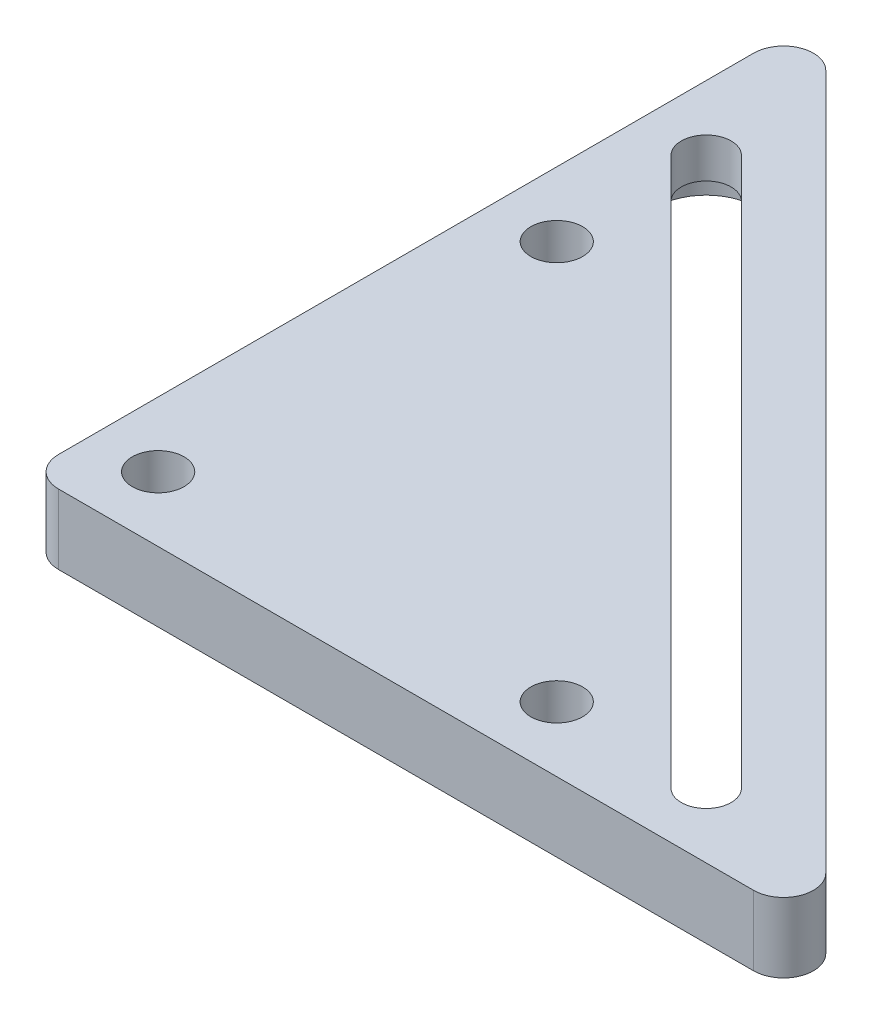
ISO-10303-21;
HEADER;
FILE_DESCRIPTION(('STEP AP214'),'2;1');
FILE_NAME('part.step','',(''),(''),'','','');
FILE_SCHEMA(('AUTOMOTIVE_DESIGN { 1 0 10303 214 1 1 1 1 }'));
ENDSEC;
DATA;
#1=APPLICATION_CONTEXT('core data for automotive mechanical design processes');
#2=APPLICATION_PROTOCOL_DEFINITION('international standard','automotive_design',2000,#1);
#3=PRODUCT_CONTEXT('',#1,'mechanical');
#4=PRODUCT('Part','Part','',(#3));
#5=PRODUCT_RELATED_PRODUCT_CATEGORY('part','',(#4));
#6=PRODUCT_DEFINITION_FORMATION('','',#4);
#7=PRODUCT_DEFINITION_CONTEXT('part definition',#1,'design');
#8=PRODUCT_DEFINITION('design','',#6,#7);
#9=PRODUCT_DEFINITION_SHAPE('','',#8);
#10=(LENGTH_UNIT() NAMED_UNIT(*) SI_UNIT(.MILLI.,.METRE.));
#11=(NAMED_UNIT(*) PLANE_ANGLE_UNIT() SI_UNIT($,.RADIAN.));
#12=(NAMED_UNIT(*) SI_UNIT($,.STERADIAN.) SOLID_ANGLE_UNIT());
#13=UNCERTAINTY_MEASURE_WITH_UNIT(LENGTH_MEASURE(1.E-05),#10,'distance_accuracy_value','');
#14=(GEOMETRIC_REPRESENTATION_CONTEXT(3) GLOBAL_UNCERTAINTY_ASSIGNED_CONTEXT((#13)) GLOBAL_UNIT_ASSIGNED_CONTEXT((#10,
#11,#12)) REPRESENTATION_CONTEXT('',''));
#15=CARTESIAN_POINT('',(0.,0.,0.));
#16=DIRECTION('',(0.,0.,1.));
#17=DIRECTION('',(1.,0.,0.));
#18=AXIS2_PLACEMENT_3D('',#15,#16,#17);
#19=CARTESIAN_POINT('',(6.5,0.,-6.5));
#20=DIRECTION('',(0.,1.,0.));
#21=DIRECTION('',(0.,0.,1.));
#22=AXIS2_PLACEMENT_3D('',#19,#20,#21);
#23=CYLINDRICAL_SURFACE('',#22,2.6);
#24=CARTESIAN_POINT('',(6.5,0.,-6.5));
#25=DIRECTION('',(0.,1.,0.));
#26=DIRECTION('',(0.,0.,1.));
#27=AXIS2_PLACEMENT_3D('',#24,#25,#26);
#28=CIRCLE('',#27,2.6);
#29=CARTESIAN_POINT('',(6.5,0.,-3.9));
#30=VERTEX_POINT('',#29);
#31=EDGE_CURVE('E291',#30,#30,#28,.T.);
#32=ORIENTED_EDGE('',*,*,#31,.F.);
#33=EDGE_LOOP('',(#32));
#34=FACE_BOUND('',#33,.T.);
#35=CARTESIAN_POINT('',(6.5,7.,-6.5));
#36=DIRECTION('',(0.,1.,0.));
#37=DIRECTION('',(0.,0.,1.));
#38=AXIS2_PLACEMENT_3D('',#35,#36,#37);
#39=CIRCLE('',#38,2.6);
#40=CARTESIAN_POINT('',(6.5,7.,-3.9));
#41=VERTEX_POINT('',#40);
#42=EDGE_CURVE('E240',#41,#41,#39,.F.);
#43=ORIENTED_EDGE('',*,*,#42,.F.);
#44=EDGE_LOOP('',(#43));
#45=FACE_BOUND('',#44,.T.);
#46=ADVANCED_FACE('F64',(#34,#45),#23,.F.);
#47=CARTESIAN_POINT('',(46.5,0.,-6.5));
#48=DIRECTION('',(0.,1.,0.));
#49=DIRECTION('',(0.,0.,1.));
#50=AXIS2_PLACEMENT_3D('',#47,#48,#49);
#51=CYLINDRICAL_SURFACE('',#50,2.6);
#52=CARTESIAN_POINT('',(46.5,0.,-6.5));
#53=DIRECTION('',(0.,1.,0.));
#54=DIRECTION('',(0.,0.,1.));
#55=AXIS2_PLACEMENT_3D('',#52,#53,#54);
#56=CIRCLE('',#55,2.6);
#57=CARTESIAN_POINT('',(46.5,0.,-3.9));
#58=VERTEX_POINT('',#57);
#59=EDGE_CURVE('E279',#58,#58,#56,.T.);
#60=ORIENTED_EDGE('',*,*,#59,.F.);
#61=EDGE_LOOP('',(#60));
#62=FACE_BOUND('',#61,.T.);
#63=CARTESIAN_POINT('',(46.5,7.,-6.5));
#64=DIRECTION('',(0.,1.,0.));
#65=DIRECTION('',(0.,0.,1.));
#66=AXIS2_PLACEMENT_3D('',#63,#64,#65);
#67=CIRCLE('',#66,2.6);
#68=CARTESIAN_POINT('',(46.5,7.,-3.9));
#69=VERTEX_POINT('',#68);
#70=EDGE_CURVE('E236',#69,#69,#67,.F.);
#71=ORIENTED_EDGE('',*,*,#70,.F.);
#72=EDGE_LOOP('',(#71));
#73=FACE_BOUND('',#72,.T.);
#74=ADVANCED_FACE('F372',(#62,#73),#51,.F.);
#75=CARTESIAN_POINT('',(3.,10.,-3.));
#76=DIRECTION('',(0.,1.,0.));
#77=DIRECTION('',(0.,0.,1.));
#78=AXIS2_PLACEMENT_3D('',#75,#76,#77);
#79=CYLINDRICAL_SURFACE('',#78,3.);
#80=DIRECTION('',(0.,1.,0.));
#81=VECTOR('',#80,1.);
#82=CARTESIAN_POINT('',(3.,10.,0.));
#83=LINE('',#82,#81);
#84=CARTESIAN_POINT('',(3.,7.,0.));
#85=VERTEX_POINT('',#84);
#86=CARTESIAN_POINT('',(3.,0.,0.));
#87=VERTEX_POINT('',#86);
#88=EDGE_CURVE('E331',#85,#87,#83,.F.);
#89=ORIENTED_EDGE('',*,*,#88,.F.);
#90=CARTESIAN_POINT('',(3.,7.,-3.));
#91=DIRECTION('',(0.,1.,0.));
#92=DIRECTION('',(0.,0.,1.));
#93=AXIS2_PLACEMENT_3D('',#90,#91,#92);
#94=CIRCLE('',#93,3.);
#95=CARTESIAN_POINT('',(0.,7.,-3.));
#96=VERTEX_POINT('',#95);
#97=EDGE_CURVE('E222',#85,#96,#94,.F.);
#98=ORIENTED_EDGE('',*,*,#97,.T.);
#99=DIRECTION('',(0.,1.,0.));
#100=VECTOR('',#99,1.);
#101=CARTESIAN_POINT('',(0.,10.,-3.));
#102=LINE('',#101,#100);
#103=CARTESIAN_POINT('',(0.,0.,-3.));
#104=VERTEX_POINT('',#103);
#105=EDGE_CURVE('E327',#104,#96,#102,.T.);
#106=ORIENTED_EDGE('',*,*,#105,.F.);
#107=CARTESIAN_POINT('',(3.,0.,-3.));
#108=DIRECTION('',(0.,1.,0.));
#109=DIRECTION('',(0.,0.,1.));
#110=AXIS2_PLACEMENT_3D('',#107,#108,#109);
#111=CIRCLE('',#110,3.);
#112=EDGE_CURVE('E73',#87,#104,#111,.F.);
#113=ORIENTED_EDGE('',*,*,#112,.F.);
#114=EDGE_LOOP('',(#89,#98,#106,#113));
#115=FACE_BOUND('',#114,.T.);
#116=ADVANCED_FACE('F66',(#115),#79,.T.);
#117=CARTESIAN_POINT('',(3.,10.,-72.7573593128807));
#118=DIRECTION('',(0.,1.,0.));
#119=DIRECTION('',(0.,0.,1.));
#120=AXIS2_PLACEMENT_3D('',#117,#118,#119);
#121=CYLINDRICAL_SURFACE('',#120,3.);
#122=DIRECTION('',(0.,1.,0.));
#123=VECTOR('',#122,1.);
#124=CARTESIAN_POINT('',(0.,10.,-72.7573593128807));
#125=LINE('',#124,#123);
#126=CARTESIAN_POINT('',(0.,7.,-72.7573593128807));
#127=VERTEX_POINT('',#126);
#128=CARTESIAN_POINT('',(0.,0.,-72.7573593128807));
#129=VERTEX_POINT('',#128);
#130=EDGE_CURVE('E321',#127,#129,#125,.F.);
#131=ORIENTED_EDGE('',*,*,#130,.F.);
#132=CARTESIAN_POINT('',(3.,7.,-72.7573593128807));
#133=DIRECTION('',(0.,1.,0.));
#134=DIRECTION('',(0.,0.,1.));
#135=AXIS2_PLACEMENT_3D('',#132,#133,#134);
#136=CIRCLE('',#135,3.);
#137=CARTESIAN_POINT('',(5.12132034355964,7.,-74.8786796564404));
#138=VERTEX_POINT('',#137);
#139=EDGE_CURVE('E213',#127,#138,#136,.F.);
#140=ORIENTED_EDGE('',*,*,#139,.T.);
#141=DIRECTION('',(0.,1.,0.));
#142=VECTOR('',#141,1.);
#143=CARTESIAN_POINT('',(5.12132034355964,10.,-74.8786796564404));
#144=LINE('',#143,#142);
#145=CARTESIAN_POINT('',(5.12132034355964,0.,-74.8786796564404));
#146=VERTEX_POINT('',#145);
#147=EDGE_CURVE('E317',#146,#138,#144,.T.);
#148=ORIENTED_EDGE('',*,*,#147,.F.);
#149=CARTESIAN_POINT('',(3.,0.,-72.7573593128807));
#150=DIRECTION('',(0.,1.,0.));
#151=DIRECTION('',(0.,0.,1.));
#152=AXIS2_PLACEMENT_3D('',#149,#150,#151);
#153=CIRCLE('',#152,3.);
#154=EDGE_CURVE('E324',#129,#146,#153,.F.);
#155=ORIENTED_EDGE('',*,*,#154,.F.);
#156=EDGE_LOOP('',(#131,#140,#148,#155));
#157=FACE_BOUND('',#156,.T.);
#158=ADVANCED_FACE('F349',(#157),#121,.T.);
#159=CARTESIAN_POINT('',(72.7573593128807,10.,-3.));
#160=DIRECTION('',(0.,1.,0.));
#161=DIRECTION('',(0.,0.,1.));
#162=AXIS2_PLACEMENT_3D('',#159,#160,#161);
#163=CYLINDRICAL_SURFACE('',#162,3.);
#164=DIRECTION('',(0.,1.,0.));
#165=VECTOR('',#164,1.);
#166=CARTESIAN_POINT('',(74.8786796564403,10.,-5.12132034355967));
#167=LINE('',#166,#165);
#168=CARTESIAN_POINT('',(74.8786796564403,7.,-5.12132034355967));
#169=VERTEX_POINT('',#168);
#170=CARTESIAN_POINT('',(74.8786796564403,0.,-5.12132034355967));
#171=VERTEX_POINT('',#170);
#172=EDGE_CURVE('E310',#169,#171,#167,.F.);
#173=ORIENTED_EDGE('',*,*,#172,.F.);
#174=CARTESIAN_POINT('',(72.7573593128807,7.,-3.));
#175=DIRECTION('',(0.,1.,0.));
#176=DIRECTION('',(0.,0.,1.));
#177=AXIS2_PLACEMENT_3D('',#174,#175,#176);
#178=CIRCLE('',#177,3.);
#179=CARTESIAN_POINT('',(72.7573593128807,7.,0.));
#180=VERTEX_POINT('',#179);
#181=EDGE_CURVE('E232',#169,#180,#178,.F.);
#182=ORIENTED_EDGE('',*,*,#181,.T.);
#183=DIRECTION('',(0.,1.,0.));
#184=VECTOR('',#183,1.);
#185=CARTESIAN_POINT('',(72.7573593128807,10.,0.));
#186=LINE('',#185,#184);
#187=CARTESIAN_POINT('',(72.7573593128807,0.,0.));
#188=VERTEX_POINT('',#187);
#189=EDGE_CURVE('E306',#188,#180,#186,.T.);
#190=ORIENTED_EDGE('',*,*,#189,.F.);
#191=CARTESIAN_POINT('',(72.7573593128807,0.,-3.));
#192=DIRECTION('',(0.,1.,0.));
#193=DIRECTION('',(0.,0.,1.));
#194=AXIS2_PLACEMENT_3D('',#191,#192,#193);
#195=CIRCLE('',#194,3.);
#196=EDGE_CURVE('E313',#171,#188,#195,.F.);
#197=ORIENTED_EDGE('',*,*,#196,.F.);
#198=EDGE_LOOP('',(#173,#182,#190,#197));
#199=FACE_BOUND('',#198,.T.);
#200=ADVANCED_FACE('F358',(#199),#163,.T.);
#201=CARTESIAN_POINT('',(0.,10.,0.));
#202=DIRECTION('',(0.,0.,-1.));
#203=DIRECTION('',(-1.,0.,0.));
#204=AXIS2_PLACEMENT_3D('',#201,#202,#203);
#205=PLANE('',#204);
#206=DIRECTION('',(1.,0.,0.));
#207=VECTOR('',#206,1.);
#208=CARTESIAN_POINT('',(0.,7.,0.));
#209=LINE('',#208,#207);
#210=EDGE_CURVE('E229',#85,#180,#209,.T.);
#211=ORIENTED_EDGE('',*,*,#210,.F.);
#212=ORIENTED_EDGE('',*,*,#88,.T.);
#213=DIRECTION('',(1.,0.,0.));
#214=VECTOR('',#213,1.);
#215=CARTESIAN_POINT('',(0.,0.,0.));
#216=LINE('',#215,#214);
#217=EDGE_CURVE('E295',#87,#188,#216,.T.);
#218=ORIENTED_EDGE('',*,*,#217,.T.);
#219=ORIENTED_EDGE('',*,*,#189,.T.);
#220=EDGE_LOOP('',(#211,#212,#218,#219));
#221=FACE_BOUND('',#220,.T.);
#222=ADVANCED_FACE('F361',(#221),#205,.F.);
#223=CARTESIAN_POINT('',(0.,10.,-80.));
#224=DIRECTION('',(-0.707106781186548,0.,0.707106781186548));
#225=DIRECTION('',(0.707106781186548,0.,0.707106781186548));
#226=AXIS2_PLACEMENT_3D('',#223,#224,#225);
#227=PLANE('',#226);
#228=DIRECTION('',(-0.707106781186548,0.,-0.707106781186548));
#229=VECTOR('',#228,1.);
#230=CARTESIAN_POINT('',(0.,7.,-80.));
#231=LINE('',#230,#229);
#232=EDGE_CURVE('E226',#169,#138,#231,.T.);
#233=ORIENTED_EDGE('',*,*,#232,.F.);
#234=ORIENTED_EDGE('',*,*,#172,.T.);
#235=DIRECTION('',(-0.707106781186548,0.,-0.707106781186548));
#236=VECTOR('',#235,1.);
#237=CARTESIAN_POINT('',(0.,0.,-80.));
#238=LINE('',#237,#236);
#239=EDGE_CURVE('E298',#171,#146,#238,.T.);
#240=ORIENTED_EDGE('',*,*,#239,.T.);
#241=ORIENTED_EDGE('',*,*,#147,.T.);
#242=EDGE_LOOP('',(#233,#234,#240,#241));
#243=FACE_BOUND('',#242,.T.);
#244=ADVANCED_FACE('F355',(#243),#227,.F.);
#245=CARTESIAN_POINT('',(0.,10.,0.));
#246=DIRECTION('',(1.,0.,0.));
#247=DIRECTION('',(0.,0.,-1.));
#248=AXIS2_PLACEMENT_3D('',#245,#246,#247);
#249=PLANE('',#248);
#250=DIRECTION('',(0.,0.,1.));
#251=VECTOR('',#250,1.);
#252=CARTESIAN_POINT('',(0.,7.,0.));
#253=LINE('',#252,#251);
#254=EDGE_CURVE('E12',#127,#96,#253,.T.);
#255=ORIENTED_EDGE('',*,*,#254,.F.);
#256=ORIENTED_EDGE('',*,*,#130,.T.);
#257=DIRECTION('',(0.,0.,1.));
#258=VECTOR('',#257,1.);
#259=CARTESIAN_POINT('',(0.,0.,0.));
#260=LINE('',#259,#258);
#261=EDGE_CURVE('E302',#129,#104,#260,.T.);
#262=ORIENTED_EDGE('',*,*,#261,.T.);
#263=ORIENTED_EDGE('',*,*,#105,.T.);
#264=EDGE_LOOP('',(#255,#256,#262,#263));
#265=FACE_BOUND('',#264,.T.);
#266=ADVANCED_FACE('F344',(#265),#249,.F.);
#267=CARTESIAN_POINT('',(0.,0.,0.));
#268=DIRECTION('',(0.,1.,0.));
#269=DIRECTION('',(0.,0.,1.));
#270=AXIS2_PLACEMENT_3D('',#267,#268,#269);
#271=PLANE('',#270);
#272=CARTESIAN_POINT('',(6.5,0.,-46.5));
#273=DIRECTION('',(0.,1.,0.));
#274=DIRECTION('',(0.,0.,1.));
#275=AXIS2_PLACEMENT_3D('',#272,#273,#274);
#276=CIRCLE('',#275,2.6);
#277=CARTESIAN_POINT('',(6.5,0.,-43.9));
#278=VERTEX_POINT('',#277);
#279=EDGE_CURVE('E205',#278,#278,#276,.T.);
#280=ORIENTED_EDGE('',*,*,#279,.T.);
#281=EDGE_LOOP('',(#280));
#282=FACE_BOUND('',#281,.T.);
#283=DIRECTION('',(0.707106781186548,0.,0.707106781186548));
#284=VECTOR('',#283,1.);
#285=CARTESIAN_POINT('',(37.5355339059327,0.,-37.5355339059327));
#286=LINE('',#285,#284);
#287=CARTESIAN_POINT('',(10.0355339059327,0.,-65.0355339059327));
#288=VERTEX_POINT('',#287);
#289=CARTESIAN_POINT('',(65.0355339059327,0.,-10.0355339059327));
#290=VERTEX_POINT('',#289);
#291=EDGE_CURVE('E244',#288,#290,#286,.T.);
#292=ORIENTED_EDGE('',*,*,#291,.F.);
#293=CARTESIAN_POINT('',(6.50000000000001,0.,-61.5));
#294=DIRECTION('',(0.,-1.,0.));
#295=DIRECTION('',(0.,0.,-1.));
#296=AXIS2_PLACEMENT_3D('',#293,#294,#295);
#297=CIRCLE('',#296,5.);
#298=CARTESIAN_POINT('',(2.96446609406727,0.,-57.9644660940673));
#299=VERTEX_POINT('',#298);
#300=EDGE_CURVE('E250',#299,#288,#297,.T.);
#301=ORIENTED_EDGE('',*,*,#300,.F.);
#302=DIRECTION('',(0.707106781186548,0.,0.707106781186548));
#303=VECTOR('',#302,1.);
#304=CARTESIAN_POINT('',(30.4644660940673,0.,-30.4644660940673));
#305=LINE('',#304,#303);
#306=CARTESIAN_POINT('',(57.9644660940673,0.,-2.96446609406726));
#307=VERTEX_POINT('',#306);
#308=EDGE_CURVE('E269',#299,#307,#305,.T.);
#309=ORIENTED_EDGE('',*,*,#308,.T.);
#310=CARTESIAN_POINT('',(61.5,0.,-6.5));
#311=DIRECTION('',(0.,-1.,0.));
#312=DIRECTION('',(0.,0.,-1.));
#313=AXIS2_PLACEMENT_3D('',#310,#311,#312);
#314=CIRCLE('',#313,5.);
#315=EDGE_CURVE('E265',#290,#307,#314,.T.);
#316=ORIENTED_EDGE('',*,*,#315,.F.);
#317=EDGE_LOOP('',(#292,#301,#309,#316));
#318=FACE_BOUND('',#317,.T.);
#319=ORIENTED_EDGE('',*,*,#59,.T.);
#320=EDGE_LOOP('',(#319));
#321=FACE_BOUND('',#320,.T.);
#322=ORIENTED_EDGE('',*,*,#31,.T.);
#323=EDGE_LOOP('',(#322));
#324=FACE_BOUND('',#323,.T.);
#325=ORIENTED_EDGE('',*,*,#217,.F.);
#326=ORIENTED_EDGE('',*,*,#112,.T.);
#327=ORIENTED_EDGE('',*,*,#261,.F.);
#328=ORIENTED_EDGE('',*,*,#154,.T.);
#329=ORIENTED_EDGE('',*,*,#239,.F.);
#330=ORIENTED_EDGE('',*,*,#196,.T.);
#331=EDGE_LOOP('',(#325,#326,#327,#328,#329,#330));
#332=FACE_BOUND('',#331,.T.);
#333=ADVANCED_FACE('F339',(#282,#318,#321,#324,#332),#271,.F.);
#334=CARTESIAN_POINT('',(6.50000000000001,3.,-61.5));
#335=DIRECTION('',(0.,-1.,0.));
#336=DIRECTION('',(0.,0.,-1.));
#337=AXIS2_PLACEMENT_3D('',#334,#335,#336);
#338=CYLINDRICAL_SURFACE('',#337,5.);
#339=ORIENTED_EDGE('',*,*,#300,.T.);
#340=DIRECTION('',(0.,-1.,0.));
#341=VECTOR('',#340,1.);
#342=CARTESIAN_POINT('',(10.0355339059327,3.,-65.0355339059327));
#343=LINE('',#342,#341);
#344=CARTESIAN_POINT('',(10.0355339059327,3.,-65.0355339059327));
#345=VERTEX_POINT('',#344);
#346=EDGE_CURVE('E275',#345,#288,#343,.T.);
#347=ORIENTED_EDGE('',*,*,#346,.F.);
#348=CARTESIAN_POINT('',(6.50000000000001,3.,-61.5));
#349=DIRECTION('',(0.,-1.,0.));
#350=DIRECTION('',(0.,0.,-1.));
#351=AXIS2_PLACEMENT_3D('',#348,#349,#350);
#352=CIRCLE('',#351,5.);
#353=CARTESIAN_POINT('',(2.96446609406727,3.,-57.9644660940673));
#354=VERTEX_POINT('',#353);
#355=EDGE_CURVE('E257',#354,#345,#352,.T.);
#356=ORIENTED_EDGE('',*,*,#355,.F.);
#357=DIRECTION('',(0.,-1.,0.));
#358=VECTOR('',#357,1.);
#359=CARTESIAN_POINT('',(2.96446609406727,3.,-57.9644660940673));
#360=LINE('',#359,#358);
#361=EDGE_CURVE('E280',#354,#299,#360,.T.);
#362=ORIENTED_EDGE('',*,*,#361,.T.);
#363=EDGE_LOOP('',(#339,#347,#356,#362));
#364=FACE_BOUND('',#363,.T.);
#365=ADVANCED_FACE('F386',(#364),#338,.F.);
#366=CARTESIAN_POINT('',(30.4644660940673,3.,-30.4644660940673));
#367=DIRECTION('',(0.707106781186547,0.,-0.707106781186547));
#368=DIRECTION('',(-0.707106781186548,0.,-0.707106781186548));
#369=AXIS2_PLACEMENT_3D('',#366,#367,#368);
#370=PLANE('',#369);
#371=ORIENTED_EDGE('',*,*,#308,.F.);
#372=ORIENTED_EDGE('',*,*,#361,.F.);
#373=DIRECTION('',(0.707106781186548,0.,0.707106781186548));
#374=VECTOR('',#373,1.);
#375=CARTESIAN_POINT('',(30.4644660940673,3.,-30.4644660940673));
#376=LINE('',#375,#374);
#377=CARTESIAN_POINT('',(57.9644660940673,3.,-2.96446609406726));
#378=VERTEX_POINT('',#377);
#379=EDGE_CURVE('E254',#354,#378,#376,.T.);
#380=ORIENTED_EDGE('',*,*,#379,.T.);
#381=DIRECTION('',(0.,-1.,0.));
#382=VECTOR('',#381,1.);
#383=CARTESIAN_POINT('',(57.9644660940673,3.,-2.96446609406726));
#384=LINE('',#383,#382);
#385=EDGE_CURVE('E283',#378,#307,#384,.T.);
#386=ORIENTED_EDGE('',*,*,#385,.T.);
#387=EDGE_LOOP('',(#371,#372,#380,#386));
#388=FACE_BOUND('',#387,.T.);
#389=ADVANCED_FACE('F531',(#388),#370,.T.);
#390=CARTESIAN_POINT('',(61.5,3.,-6.5));
#391=DIRECTION('',(0.,-1.,0.));
#392=DIRECTION('',(0.,0.,-1.));
#393=AXIS2_PLACEMENT_3D('',#390,#391,#392);
#394=CYLINDRICAL_SURFACE('',#393,5.);
#395=ORIENTED_EDGE('',*,*,#315,.T.);
#396=ORIENTED_EDGE('',*,*,#385,.F.);
#397=CARTESIAN_POINT('',(61.5,3.,-6.5));
#398=DIRECTION('',(0.,-1.,0.));
#399=DIRECTION('',(0.,0.,-1.));
#400=AXIS2_PLACEMENT_3D('',#397,#398,#399);
#401=CIRCLE('',#400,5.);
#402=CARTESIAN_POINT('',(65.0355339059327,3.,-10.0355339059327));
#403=VERTEX_POINT('',#402);
#404=EDGE_CURVE('E249',#403,#378,#401,.T.);
#405=ORIENTED_EDGE('',*,*,#404,.F.);
#406=DIRECTION('',(0.,-1.,0.));
#407=VECTOR('',#406,1.);
#408=CARTESIAN_POINT('',(65.0355339059327,3.,-10.0355339059327));
#409=LINE('',#408,#407);
#410=EDGE_CURVE('E261',#403,#290,#409,.T.);
#411=ORIENTED_EDGE('',*,*,#410,.T.);
#412=EDGE_LOOP('',(#395,#396,#405,#411));
#413=FACE_BOUND('',#412,.T.);
#414=ADVANCED_FACE('F523',(#413),#394,.F.);
#415=CARTESIAN_POINT('',(37.5355339059327,3.,-37.5355339059327));
#416=DIRECTION('',(0.707106781186547,0.,-0.707106781186547));
#417=DIRECTION('',(-0.707106781186548,0.,-0.707106781186548));
#418=AXIS2_PLACEMENT_3D('',#415,#416,#417);
#419=PLANE('',#418);
#420=ORIENTED_EDGE('',*,*,#291,.T.);
#421=ORIENTED_EDGE('',*,*,#410,.F.);
#422=DIRECTION('',(0.707106781186548,0.,0.707106781186548));
#423=VECTOR('',#422,1.);
#424=CARTESIAN_POINT('',(37.5355339059327,3.,-37.5355339059327));
#425=LINE('',#424,#423);
#426=EDGE_CURVE('E245',#345,#403,#425,.T.);
#427=ORIENTED_EDGE('',*,*,#426,.F.);
#428=ORIENTED_EDGE('',*,*,#346,.T.);
#429=EDGE_LOOP('',(#420,#421,#427,#428));
#430=FACE_BOUND('',#429,.T.);
#431=ADVANCED_FACE('F475',(#430),#419,.F.);
#432=CARTESIAN_POINT('',(0.,3.,0.));
#433=DIRECTION('',(0.,-1.,0.));
#434=DIRECTION('',(0.,0.,-1.));
#435=AXIS2_PLACEMENT_3D('',#432,#433,#434);
#436=PLANE('',#435);
#437=CARTESIAN_POINT('',(6.50000000000001,3.,-61.5));
#438=DIRECTION('',(0.,-1.,0.));
#439=DIRECTION('',(0.,0.,-1.));
#440=AXIS2_PLACEMENT_3D('',#437,#438,#439);
#441=CIRCLE('',#440,2.5);
#442=CARTESIAN_POINT('',(4.73223304703364,3.,-59.7322330470336));
#443=VERTEX_POINT('',#442);
#444=CARTESIAN_POINT('',(8.26776695296638,3.,-63.2677669529664));
#445=VERTEX_POINT('',#444);
#446=EDGE_CURVE('E171',#443,#445,#441,.T.);
#447=ORIENTED_EDGE('',*,*,#446,.F.);
#448=DIRECTION('',(-0.707106781186547,0.,-0.707106781186547));
#449=VECTOR('',#448,1.);
#450=CARTESIAN_POINT('',(59.7322330470336,3.,-4.73223304703363));
#451=LINE('',#450,#449);
#452=CARTESIAN_POINT('',(59.7322330470336,3.,-4.73223304703363));
#453=VERTEX_POINT('',#452);
#454=EDGE_CURVE('E189',#453,#443,#451,.T.);
#455=ORIENTED_EDGE('',*,*,#454,.F.);
#456=CARTESIAN_POINT('',(61.5,3.,-6.5));
#457=DIRECTION('',(0.,-1.,0.));
#458=DIRECTION('',(0.,0.,-1.));
#459=AXIS2_PLACEMENT_3D('',#456,#457,#458);
#460=CIRCLE('',#459,2.5);
#461=CARTESIAN_POINT('',(63.2677669529664,3.,-8.26776695296638));
#462=VERTEX_POINT('',#461);
#463=EDGE_CURVE('E80',#462,#453,#460,.T.);
#464=ORIENTED_EDGE('',*,*,#463,.F.);
#465=DIRECTION('',(0.707106781186547,0.,0.707106781186547));
#466=VECTOR('',#465,1.);
#467=CARTESIAN_POINT('',(8.26776695296638,3.,-63.2677669529664));
#468=LINE('',#467,#466);
#469=EDGE_CURVE('E204',#445,#462,#468,.T.);
#470=ORIENTED_EDGE('',*,*,#469,.F.);
#471=EDGE_LOOP('',(#447,#455,#464,#470));
#472=FACE_BOUND('',#471,.T.);
#473=ORIENTED_EDGE('',*,*,#426,.T.);
#474=ORIENTED_EDGE('',*,*,#404,.T.);
#475=ORIENTED_EDGE('',*,*,#379,.F.);
#476=ORIENTED_EDGE('',*,*,#355,.T.);
#477=EDGE_LOOP('',(#473,#474,#475,#476));
#478=FACE_BOUND('',#477,.T.);
#479=ADVANCED_FACE('F364',(#472,#478),#436,.T.);
#480=CARTESIAN_POINT('',(0.,7.,0.));
#481=DIRECTION('',(0.,1.,0.));
#482=DIRECTION('',(0.,0.,1.));
#483=AXIS2_PLACEMENT_3D('',#480,#481,#482);
#484=PLANE('',#483);
#485=CARTESIAN_POINT('',(6.5,7.,-46.5));
#486=DIRECTION('',(0.,1.,0.));
#487=DIRECTION('',(0.,0.,1.));
#488=AXIS2_PLACEMENT_3D('',#485,#486,#487);
#489=CIRCLE('',#488,2.6);
#490=CARTESIAN_POINT('',(6.5,7.,-43.9));
#491=VERTEX_POINT('',#490);
#492=EDGE_CURVE('E195',#491,#491,#489,.T.);
#493=ORIENTED_EDGE('',*,*,#492,.F.);
#494=EDGE_LOOP('',(#493));
#495=FACE_BOUND('',#494,.T.);
#496=CARTESIAN_POINT('',(6.50000000000001,7.,-61.5));
#497=DIRECTION('',(0.,-1.,0.));
#498=DIRECTION('',(0.,0.,-1.));
#499=AXIS2_PLACEMENT_3D('',#496,#497,#498);
#500=CIRCLE('',#499,2.5);
#501=CARTESIAN_POINT('',(4.73223304703364,7.,-59.7322330470336));
#502=VERTEX_POINT('',#501);
#503=CARTESIAN_POINT('',(8.26776695296638,7.,-63.2677669529664));
#504=VERTEX_POINT('',#503);
#505=EDGE_CURVE('E168',#502,#504,#500,.T.);
#506=ORIENTED_EDGE('',*,*,#505,.T.);
#507=DIRECTION('',(0.707106781186547,0.,0.707106781186547));
#508=VECTOR('',#507,1.);
#509=CARTESIAN_POINT('',(8.26776695296638,7.,-63.2677669529664));
#510=LINE('',#509,#508);
#511=CARTESIAN_POINT('',(63.2677669529664,7.,-8.26776695296638));
#512=VERTEX_POINT('',#511);
#513=EDGE_CURVE('E180',#504,#512,#510,.T.);
#514=ORIENTED_EDGE('',*,*,#513,.T.);
#515=CARTESIAN_POINT('',(61.5,7.,-6.5));
#516=DIRECTION('',(0.,-1.,0.));
#517=DIRECTION('',(0.,0.,-1.));
#518=AXIS2_PLACEMENT_3D('',#515,#516,#517);
#519=CIRCLE('',#518,2.5);
#520=CARTESIAN_POINT('',(59.7322330470336,7.,-4.73223304703363));
#521=VERTEX_POINT('',#520);
#522=EDGE_CURVE('E85',#512,#521,#519,.T.);
#523=ORIENTED_EDGE('',*,*,#522,.T.);
#524=DIRECTION('',(-0.707106781186547,0.,-0.707106781186547));
#525=VECTOR('',#524,1.);
#526=CARTESIAN_POINT('',(59.7322330470336,7.,-4.73223304703363));
#527=LINE('',#526,#525);
#528=EDGE_CURVE('E177',#521,#502,#527,.T.);
#529=ORIENTED_EDGE('',*,*,#528,.T.);
#530=EDGE_LOOP('',(#506,#514,#523,#529));
#531=FACE_BOUND('',#530,.T.);
#532=ORIENTED_EDGE('',*,*,#232,.T.);
#533=ORIENTED_EDGE('',*,*,#139,.F.);
#534=ORIENTED_EDGE('',*,*,#254,.T.);
#535=ORIENTED_EDGE('',*,*,#97,.F.);
#536=ORIENTED_EDGE('',*,*,#210,.T.);
#537=ORIENTED_EDGE('',*,*,#181,.F.);
#538=EDGE_LOOP('',(#532,#533,#534,#535,#536,#537));
#539=FACE_BOUND('',#538,.T.);
#540=ORIENTED_EDGE('',*,*,#70,.T.);
#541=EDGE_LOOP('',(#540));
#542=FACE_BOUND('',#541,.T.);
#543=ORIENTED_EDGE('',*,*,#42,.T.);
#544=EDGE_LOOP('',(#543));
#545=FACE_BOUND('',#544,.T.);
#546=ADVANCED_FACE('F185',(#495,#531,#539,#542,#545),#484,.T.);
#547=CARTESIAN_POINT('',(6.50000000000001,7.,-61.5));
#548=DIRECTION('',(0.,-1.,0.));
#549=DIRECTION('',(0.,0.,-1.));
#550=AXIS2_PLACEMENT_3D('',#547,#548,#549);
#551=CYLINDRICAL_SURFACE('',#550,2.5);
#552=ORIENTED_EDGE('',*,*,#446,.T.);
#553=DIRECTION('',(0.,-1.,0.));
#554=VECTOR('',#553,1.);
#555=CARTESIAN_POINT('',(8.26776695296638,7.,-63.2677669529664));
#556=LINE('',#555,#554);
#557=EDGE_CURVE('E164',#504,#445,#556,.T.);
#558=ORIENTED_EDGE('',*,*,#557,.F.);
#559=ORIENTED_EDGE('',*,*,#505,.F.);
#560=DIRECTION('',(0.,-1.,0.));
#561=VECTOR('',#560,1.);
#562=CARTESIAN_POINT('',(4.73223304703364,7.,-59.7322330470336));
#563=LINE('',#562,#561);
#564=EDGE_CURVE('E210',#502,#443,#563,.T.);
#565=ORIENTED_EDGE('',*,*,#564,.T.);
#566=EDGE_LOOP('',(#552,#558,#559,#565));
#567=FACE_BOUND('',#566,.T.);
#568=ADVANCED_FACE('F166',(#567),#551,.F.);
#569=CARTESIAN_POINT('',(59.7322330470336,7.,-4.73223304703363));
#570=DIRECTION('',(-0.707106781186547,0.,0.707106781186547));
#571=DIRECTION('',(0.707106781186548,0.,0.707106781186548));
#572=AXIS2_PLACEMENT_3D('',#569,#570,#571);
#573=PLANE('',#572);
#574=ORIENTED_EDGE('',*,*,#454,.T.);
#575=ORIENTED_EDGE('',*,*,#564,.F.);
#576=ORIENTED_EDGE('',*,*,#528,.F.);
#577=DIRECTION('',(0.,-1.,0.));
#578=VECTOR('',#577,1.);
#579=CARTESIAN_POINT('',(59.7322330470336,7.,-4.73223304703363));
#580=LINE('',#579,#578);
#581=EDGE_CURVE('E214',#521,#453,#580,.T.);
#582=ORIENTED_EDGE('',*,*,#581,.T.);
#583=EDGE_LOOP('',(#574,#575,#576,#582));
#584=FACE_BOUND('',#583,.T.);
#585=ADVANCED_FACE('F425',(#584),#573,.F.);
#586=CARTESIAN_POINT('',(61.5,7.,-6.5));
#587=DIRECTION('',(0.,-1.,0.));
#588=DIRECTION('',(0.,0.,-1.));
#589=AXIS2_PLACEMENT_3D('',#586,#587,#588);
#590=CYLINDRICAL_SURFACE('',#589,2.5);
#591=ORIENTED_EDGE('',*,*,#463,.T.);
#592=ORIENTED_EDGE('',*,*,#581,.F.);
#593=ORIENTED_EDGE('',*,*,#522,.F.);
#594=DIRECTION('',(0.,-1.,0.));
#595=VECTOR('',#594,1.);
#596=CARTESIAN_POINT('',(63.2677669529664,7.,-8.26776695296638));
#597=LINE('',#596,#595);
#598=EDGE_CURVE('E176',#512,#462,#597,.T.);
#599=ORIENTED_EDGE('',*,*,#598,.T.);
#600=EDGE_LOOP('',(#591,#592,#593,#599));
#601=FACE_BOUND('',#600,.T.);
#602=ADVANCED_FACE('F433',(#601),#590,.F.);
#603=CARTESIAN_POINT('',(8.26776695296638,7.,-63.2677669529664));
#604=DIRECTION('',(0.707106781186547,0.,-0.707106781186547));
#605=DIRECTION('',(-0.707106781186548,0.,-0.707106781186548));
#606=AXIS2_PLACEMENT_3D('',#603,#604,#605);
#607=PLANE('',#606);
#608=ORIENTED_EDGE('',*,*,#469,.T.);
#609=ORIENTED_EDGE('',*,*,#598,.F.);
#610=ORIENTED_EDGE('',*,*,#513,.F.);
#611=ORIENTED_EDGE('',*,*,#557,.T.);
#612=EDGE_LOOP('',(#608,#609,#610,#611));
#613=FACE_BOUND('',#612,.T.);
#614=ADVANCED_FACE('F181',(#613),#607,.F.);
#615=CARTESIAN_POINT('',(6.5,0.,-46.5));
#616=DIRECTION('',(0.,1.,0.));
#617=DIRECTION('',(0.,0.,1.));
#618=AXIS2_PLACEMENT_3D('',#615,#616,#617);
#619=CYLINDRICAL_SURFACE('',#618,2.6);
#620=ORIENTED_EDGE('',*,*,#279,.F.);
#621=EDGE_LOOP('',(#620));
#622=FACE_BOUND('',#621,.T.);
#623=ORIENTED_EDGE('',*,*,#492,.T.);
#624=EDGE_LOOP('',(#623));
#625=FACE_BOUND('',#624,.T.);
#626=ADVANCED_FACE('F449',(#622,#625),#619,.F.);
#627=CLOSED_SHELL('',(#46,#74,#116,#158,#200,#222,#244,#266,#333,#365,#389,#414,#431,#479,#546,
#568,#585,#602,#614,#626));
#628=MANIFOLD_SOLID_BREP('B2',#627);
#629=ADVANCED_BREP_SHAPE_REPRESENTATION('',(#18,#628),#14);
#630=SHAPE_DEFINITION_REPRESENTATION(#9,#629);
ENDSEC;
END-ISO-10303-21;
